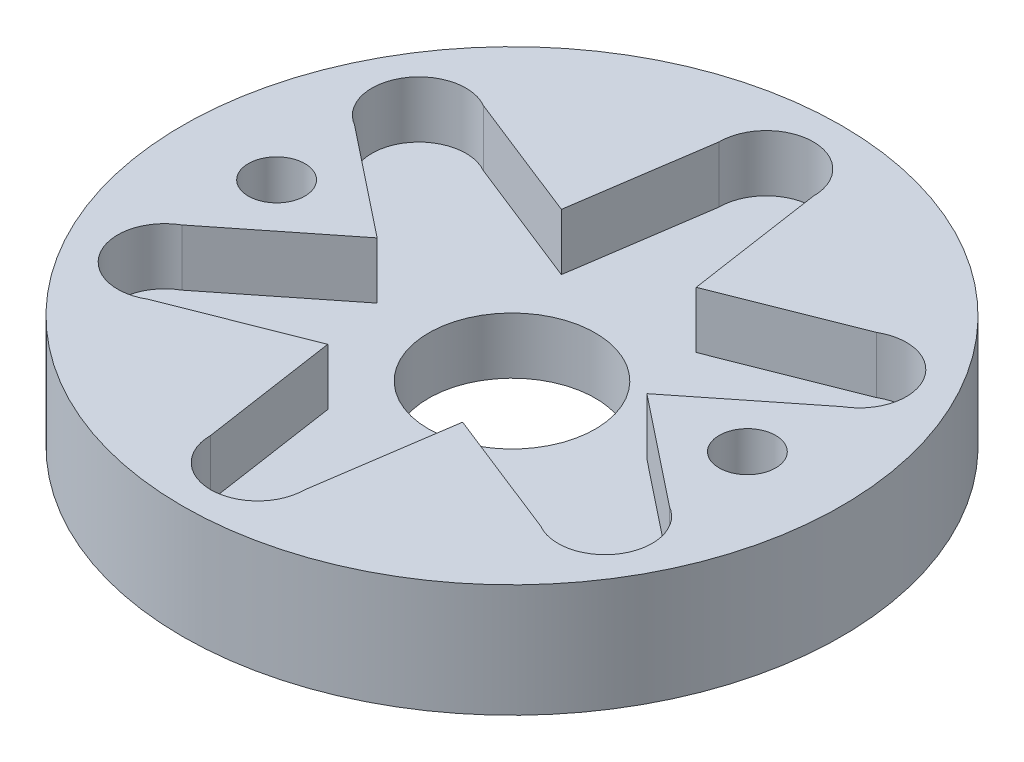
ISO-10303-21;
HEADER;
FILE_DESCRIPTION(('STEP AP214'),'2;1');
FILE_NAME('part.step','',(''),(''),'','','');
FILE_SCHEMA(('AUTOMOTIVE_DESIGN { 1 0 10303 214 1 1 1 1 }'));
ENDSEC;
DATA;
#1=APPLICATION_CONTEXT('core data for automotive mechanical design processes');
#2=APPLICATION_PROTOCOL_DEFINITION('international standard','automotive_design',2000,#1);
#3=PRODUCT_CONTEXT('',#1,'mechanical');
#4=PRODUCT('Part','Part','',(#3));
#5=PRODUCT_RELATED_PRODUCT_CATEGORY('part','',(#4));
#6=PRODUCT_DEFINITION_FORMATION('','',#4);
#7=PRODUCT_DEFINITION_CONTEXT('part definition',#1,'design');
#8=PRODUCT_DEFINITION('design','',#6,#7);
#9=PRODUCT_DEFINITION_SHAPE('','',#8);
#10=(LENGTH_UNIT() NAMED_UNIT(*) SI_UNIT(.MILLI.,.METRE.));
#11=(NAMED_UNIT(*) PLANE_ANGLE_UNIT() SI_UNIT($,.RADIAN.));
#12=(NAMED_UNIT(*) SI_UNIT($,.STERADIAN.) SOLID_ANGLE_UNIT());
#13=UNCERTAINTY_MEASURE_WITH_UNIT(LENGTH_MEASURE(1.E-05),#10,'distance_accuracy_value','');
#14=(GEOMETRIC_REPRESENTATION_CONTEXT(3) GLOBAL_UNCERTAINTY_ASSIGNED_CONTEXT((#13)) GLOBAL_UNIT_ASSIGNED_CONTEXT((#10,
#11,#12)) REPRESENTATION_CONTEXT('',''));
#15=CARTESIAN_POINT('',(0.,0.,0.));
#16=DIRECTION('',(0.,0.,1.));
#17=DIRECTION('',(1.,0.,0.));
#18=AXIS2_PLACEMENT_3D('',#15,#16,#17);
#19=CARTESIAN_POINT('',(12.5,-4.,0.));
#20=DIRECTION('',(0.,1.,0.));
#21=DIRECTION('',(0.,0.,1.));
#22=AXIS2_PLACEMENT_3D('',#19,#20,#21);
#23=CYLINDRICAL_SURFACE('',#22,1.5);
#24=CARTESIAN_POINT('',(12.5,6.,0.));
#25=DIRECTION('',(0.,1.,0.));
#26=DIRECTION('',(0.,0.,1.));
#27=AXIS2_PLACEMENT_3D('',#24,#25,#26);
#28=CIRCLE('',#27,1.5);
#29=CARTESIAN_POINT('',(12.5,6.,1.5));
#30=VERTEX_POINT('',#29);
#31=EDGE_CURVE('E367',#30,#30,#28,.T.);
#32=ORIENTED_EDGE('',*,*,#31,.T.);
#33=EDGE_LOOP('',(#32));
#34=FACE_BOUND('',#33,.T.);
#35=CARTESIAN_POINT('',(12.5,1.5,0.));
#36=DIRECTION('',(0.,-1.,0.));
#37=DIRECTION('',(0.,0.,-1.));
#38=AXIS2_PLACEMENT_3D('',#35,#36,#37);
#39=CIRCLE('',#38,1.5);
#40=CARTESIAN_POINT('',(12.5,1.5,-1.5));
#41=VERTEX_POINT('',#40);
#42=EDGE_CURVE('E97',#41,#41,#39,.F.);
#43=ORIENTED_EDGE('',*,*,#42,.F.);
#44=EDGE_LOOP('',(#43));
#45=FACE_BOUND('',#44,.T.);
#46=ADVANCED_FACE('F93',(#34,#45),#23,.F.);
#47=CARTESIAN_POINT('',(-12.5,-4.,0.));
#48=DIRECTION('',(0.,1.,0.));
#49=DIRECTION('',(0.,0.,1.));
#50=AXIS2_PLACEMENT_3D('',#47,#48,#49);
#51=CYLINDRICAL_SURFACE('',#50,1.5);
#52=CARTESIAN_POINT('',(-12.5,6.,0.));
#53=DIRECTION('',(0.,1.,0.));
#54=DIRECTION('',(0.,0.,1.));
#55=AXIS2_PLACEMENT_3D('',#52,#53,#54);
#56=CIRCLE('',#55,1.5);
#57=CARTESIAN_POINT('',(-12.5,6.,1.5));
#58=VERTEX_POINT('',#57);
#59=EDGE_CURVE('E268',#58,#58,#56,.T.);
#60=ORIENTED_EDGE('',*,*,#59,.T.);
#61=EDGE_LOOP('',(#60));
#62=FACE_BOUND('',#61,.T.);
#63=CARTESIAN_POINT('',(-12.5,1.5,0.));
#64=DIRECTION('',(0.,-1.,0.));
#65=DIRECTION('',(0.,0.,-1.));
#66=AXIS2_PLACEMENT_3D('',#63,#64,#65);
#67=CIRCLE('',#66,1.5);
#68=CARTESIAN_POINT('',(-12.5,1.5,-1.5));
#69=VERTEX_POINT('',#68);
#70=EDGE_CURVE('E361',#69,#69,#67,.F.);
#71=ORIENTED_EDGE('',*,*,#70,.F.);
#72=EDGE_LOOP('',(#71));
#73=FACE_BOUND('',#72,.T.);
#74=ADVANCED_FACE('F429',(#62,#73),#51,.F.);
#75=CARTESIAN_POINT('',(-11.6913429510899,6.,-6.74999999999999));
#76=DIRECTION('',(0.,-1.,0.));
#77=DIRECTION('',(0.,0.,-1.));
#78=AXIS2_PLACEMENT_3D('',#75,#76,#77);
#79=CYLINDRICAL_SURFACE('',#78,2.5);
#80=CARTESIAN_POINT('',(-11.6913429510899,3.,-6.74999999999999));
#81=DIRECTION('',(0.,1.,0.));
#82=DIRECTION('',(0.,0.,1.));
#83=AXIS2_PLACEMENT_3D('',#80,#81,#82);
#84=CIRCLE('',#83,2.5);
#85=CARTESIAN_POINT('',(-10.4413429510899,3.,-8.91506350946109));
#86=VERTEX_POINT('',#85);
#87=CARTESIAN_POINT('',(-12.9413429510899,3.,-4.58493649053889));
#88=VERTEX_POINT('',#87);
#89=EDGE_CURVE('E110',#86,#88,#84,.T.);
#90=ORIENTED_EDGE('',*,*,#89,.F.);
#91=DIRECTION('',(0.,-1.,0.));
#92=VECTOR('',#91,1.);
#93=CARTESIAN_POINT('',(-10.4413429510899,6.,-8.91506350946109));
#94=LINE('',#93,#92);
#95=CARTESIAN_POINT('',(-10.4413429510899,6.,-8.91506350946109));
#96=VERTEX_POINT('',#95);
#97=EDGE_CURVE('E12',#96,#86,#94,.T.);
#98=ORIENTED_EDGE('',*,*,#97,.F.);
#99=CARTESIAN_POINT('',(-11.6913429510899,6.,-6.74999999999999));
#100=DIRECTION('',(0.,1.,0.));
#101=DIRECTION('',(0.,0.,1.));
#102=AXIS2_PLACEMENT_3D('',#99,#100,#101);
#103=CIRCLE('',#102,2.5);
#104=CARTESIAN_POINT('',(-12.9413429510899,6.,-4.58493649053889));
#105=VERTEX_POINT('',#104);
#106=EDGE_CURVE('E269',#96,#105,#103,.T.);
#107=ORIENTED_EDGE('',*,*,#106,.T.);
#108=DIRECTION('',(0.,-1.,0.));
#109=VECTOR('',#108,1.);
#110=CARTESIAN_POINT('',(-12.9413429510899,6.,-4.58493649053889));
#111=LINE('',#110,#109);
#112=EDGE_CURVE('E231',#105,#88,#111,.T.);
#113=ORIENTED_EDGE('',*,*,#112,.T.);
#114=EDGE_LOOP('',(#90,#98,#107,#113));
#115=FACE_BOUND('',#114,.T.);
#116=ADVANCED_FACE('F95',(#115),#79,.F.);
#117=CARTESIAN_POINT('',(1.63672705202787,6.,-4.13959239881188));
#118=DIRECTION('',(0.367686867782864,0.,-0.929949658454707));
#119=DIRECTION('',(-0.929949658454707,0.,-0.367686867782864));
#120=AXIS2_PLACEMENT_3D('',#117,#118,#119);
#121=PLANE('',#120);
#122=ORIENTED_EDGE('',*,*,#97,.T.);
#123=DIRECTION('',(0.929949658454707,0.,0.367686867782864));
#124=VECTOR('',#123,1.);
#125=CARTESIAN_POINT('',(1.63672705202787,3.,-4.13959239881188));
#126=LINE('',#125,#124);
#127=CARTESIAN_POINT('',(-3.58109149415789,3.,-6.20263241443421));
#128=VERTEX_POINT('',#127);
#129=EDGE_CURVE('E116',#86,#128,#126,.T.);
#130=ORIENTED_EDGE('',*,*,#129,.T.);
#131=DIRECTION('',(0.,-1.,0.));
#132=VECTOR('',#131,1.);
#133=CARTESIAN_POINT('',(-3.58109149415789,6.,-6.20263241443421));
#134=LINE('',#133,#132);
#135=CARTESIAN_POINT('',(-3.58109149415789,6.,-6.20263241443421));
#136=VERTEX_POINT('',#135);
#137=EDGE_CURVE('E102',#136,#128,#134,.T.);
#138=ORIENTED_EDGE('',*,*,#137,.F.);
#139=DIRECTION('',(0.929949658454707,0.,0.367686867782864));
#140=VECTOR('',#139,1.);
#141=CARTESIAN_POINT('',(1.63672705202787,6.,-4.13959239881188));
#142=LINE('',#141,#140);
#143=EDGE_CURVE('E272',#96,#136,#142,.T.);
#144=ORIENTED_EDGE('',*,*,#143,.F.);
#145=EDGE_LOOP('',(#122,#130,#138,#144));
#146=FACE_BOUND('',#145,.T.);
#147=ADVANCED_FACE('F422',(#146),#121,.F.);
#148=CARTESIAN_POINT('',(-4.40335570469799,6.,-0.65234899328859));
#149=DIRECTION('',(0.989203462353871,0.,0.146548661089462));
#150=DIRECTION('',(0.146548661089462,0.,-0.989203462353871));
#151=AXIS2_PLACEMENT_3D('',#148,#149,#150);
#152=PLANE('',#151);
#153=DIRECTION('',(-0.146548661089462,0.,0.989203462353871));
#154=VECTOR('',#153,1.);
#155=CARTESIAN_POINT('',(-4.40335570469799,3.,-0.65234899328859));
#156=LINE('',#155,#154);
#157=CARTESIAN_POINT('',(-2.5,3.,-13.5));
#158=VERTEX_POINT('',#157);
#159=EDGE_CURVE('E405',#158,#128,#156,.T.);
#160=ORIENTED_EDGE('',*,*,#159,.F.);
#161=DIRECTION('',(0.,-1.,0.));
#162=VECTOR('',#161,1.);
#163=CARTESIAN_POINT('',(-2.5,6.,-13.5));
#164=LINE('',#163,#162);
#165=CARTESIAN_POINT('',(-2.5,6.,-13.5));
#166=VERTEX_POINT('',#165);
#167=EDGE_CURVE('E358',#166,#158,#164,.T.);
#168=ORIENTED_EDGE('',*,*,#167,.F.);
#169=DIRECTION('',(-0.146548661089462,0.,0.989203462353871));
#170=VECTOR('',#169,1.);
#171=CARTESIAN_POINT('',(-4.40335570469799,6.,-0.65234899328859));
#172=LINE('',#171,#170);
#173=EDGE_CURVE('E274',#166,#136,#172,.T.);
#174=ORIENTED_EDGE('',*,*,#173,.T.);
#175=ORIENTED_EDGE('',*,*,#137,.T.);
#176=EDGE_LOOP('',(#160,#168,#174,#175));
#177=FACE_BOUND('',#176,.T.);
#178=ADVANCED_FACE('F409',(#177),#152,.T.);
#179=CARTESIAN_POINT('',(0.,6.,-13.5));
#180=DIRECTION('',(0.,-1.,0.));
#181=DIRECTION('',(0.,0.,-1.));
#182=AXIS2_PLACEMENT_3D('',#179,#180,#181);
#183=CYLINDRICAL_SURFACE('',#182,2.5);
#184=CARTESIAN_POINT('',(0.,3.,-13.5));
#185=DIRECTION('',(0.,1.,0.));
#186=DIRECTION('',(0.,0.,1.));
#187=AXIS2_PLACEMENT_3D('',#184,#185,#186);
#188=CIRCLE('',#187,2.5);
#189=CARTESIAN_POINT('',(2.5,3.,-13.5));
#190=VERTEX_POINT('',#189);
#191=EDGE_CURVE('E402',#190,#158,#188,.T.);
#192=ORIENTED_EDGE('',*,*,#191,.F.);
#193=DIRECTION('',(0.,-1.,0.));
#194=VECTOR('',#193,1.);
#195=CARTESIAN_POINT('',(2.5,6.,-13.5));
#196=LINE('',#195,#194);
#197=CARTESIAN_POINT('',(2.5,6.,-13.5));
#198=VERTEX_POINT('',#197);
#199=EDGE_CURVE('E355',#198,#190,#196,.T.);
#200=ORIENTED_EDGE('',*,*,#199,.F.);
#201=CARTESIAN_POINT('',(0.,6.,-13.5));
#202=DIRECTION('',(0.,1.,0.));
#203=DIRECTION('',(0.,0.,1.));
#204=AXIS2_PLACEMENT_3D('',#201,#202,#203);
#205=CIRCLE('',#204,2.5);
#206=EDGE_CURVE('E277',#198,#166,#205,.T.);
#207=ORIENTED_EDGE('',*,*,#206,.T.);
#208=ORIENTED_EDGE('',*,*,#167,.T.);
#209=EDGE_LOOP('',(#192,#200,#207,#208));
#210=FACE_BOUND('',#209,.T.);
#211=ADVANCED_FACE('F412',(#210),#183,.F.);
#212=CARTESIAN_POINT('',(4.40335570469799,6.,-0.65234899328859));
#213=DIRECTION('',(0.989203462353871,0.,-0.146548661089462));
#214=DIRECTION('',(-0.146548661089462,0.,-0.989203462353871));
#215=AXIS2_PLACEMENT_3D('',#212,#213,#214);
#216=PLANE('',#215);
#217=ORIENTED_EDGE('',*,*,#199,.T.);
#218=DIRECTION('',(0.146548661089462,0.,0.989203462353871));
#219=VECTOR('',#218,1.);
#220=CARTESIAN_POINT('',(4.40335570469799,3.,-0.65234899328859));
#221=LINE('',#220,#219);
#222=CARTESIAN_POINT('',(3.58109149415789,3.,-6.20263241443422));
#223=VERTEX_POINT('',#222);
#224=EDGE_CURVE('E400',#190,#223,#221,.T.);
#225=ORIENTED_EDGE('',*,*,#224,.T.);
#226=DIRECTION('',(0.,-1.,0.));
#227=VECTOR('',#226,1.);
#228=CARTESIAN_POINT('',(3.58109149415789,6.,-6.20263241443422));
#229=LINE('',#228,#227);
#230=CARTESIAN_POINT('',(3.58109149415789,6.,-6.20263241443422));
#231=VERTEX_POINT('',#230);
#232=EDGE_CURVE('E352',#231,#223,#229,.T.);
#233=ORIENTED_EDGE('',*,*,#232,.F.);
#234=DIRECTION('',(0.146548661089462,0.,0.989203462353871));
#235=VECTOR('',#234,1.);
#236=CARTESIAN_POINT('',(4.40335570469799,6.,-0.65234899328859));
#237=LINE('',#236,#235);
#238=EDGE_CURVE('E280',#198,#231,#237,.T.);
#239=ORIENTED_EDGE('',*,*,#238,.F.);
#240=EDGE_LOOP('',(#217,#225,#233,#239));
#241=FACE_BOUND('',#240,.T.);
#242=ADVANCED_FACE('F506',(#241),#216,.F.);
#243=CARTESIAN_POINT('',(-1.63672705202787,6.,-4.13959239881188));
#244=DIRECTION('',(0.367686867782865,0.,0.929949658454707));
#245=DIRECTION('',(0.929949658454707,0.,-0.367686867782865));
#246=AXIS2_PLACEMENT_3D('',#243,#244,#245);
#247=PLANE('',#246);
#248=DIRECTION('',(-0.929949658454707,0.,0.367686867782865));
#249=VECTOR('',#248,1.);
#250=CARTESIAN_POINT('',(-1.63672705202787,3.,-4.13959239881188));
#251=LINE('',#250,#249);
#252=CARTESIAN_POINT('',(10.4413429510899,3.,-8.9150635094611));
#253=VERTEX_POINT('',#252);
#254=EDGE_CURVE('E397',#253,#223,#251,.T.);
#255=ORIENTED_EDGE('',*,*,#254,.F.);
#256=DIRECTION('',(0.,-1.,0.));
#257=VECTOR('',#256,1.);
#258=CARTESIAN_POINT('',(10.4413429510899,6.,-8.9150635094611));
#259=LINE('',#258,#257);
#260=CARTESIAN_POINT('',(10.4413429510899,6.,-8.9150635094611));
#261=VERTEX_POINT('',#260);
#262=EDGE_CURVE('E349',#261,#253,#259,.T.);
#263=ORIENTED_EDGE('',*,*,#262,.F.);
#264=DIRECTION('',(-0.929949658454707,0.,0.367686867782865));
#265=VECTOR('',#264,1.);
#266=CARTESIAN_POINT('',(-1.63672705202787,6.,-4.13959239881188));
#267=LINE('',#266,#265);
#268=EDGE_CURVE('E282',#261,#231,#267,.T.);
#269=ORIENTED_EDGE('',*,*,#268,.T.);
#270=ORIENTED_EDGE('',*,*,#232,.T.);
#271=EDGE_LOOP('',(#255,#263,#269,#270));
#272=FACE_BOUND('',#271,.T.);
#273=ADVANCED_FACE('F502',(#272),#247,.T.);
#274=CARTESIAN_POINT('',(11.6913429510899,6.,-6.75));
#275=DIRECTION('',(0.,-1.,0.));
#276=DIRECTION('',(0.,0.,-1.));
#277=AXIS2_PLACEMENT_3D('',#274,#275,#276);
#278=CYLINDRICAL_SURFACE('',#277,2.5);
#279=CARTESIAN_POINT('',(11.6913429510899,3.,-6.75));
#280=DIRECTION('',(0.,1.,0.));
#281=DIRECTION('',(0.,0.,1.));
#282=AXIS2_PLACEMENT_3D('',#279,#280,#281);
#283=CIRCLE('',#282,2.5);
#284=CARTESIAN_POINT('',(12.9413429510899,3.,-4.58493649053891));
#285=VERTEX_POINT('',#284);
#286=EDGE_CURVE('E394',#285,#253,#283,.T.);
#287=ORIENTED_EDGE('',*,*,#286,.F.);
#288=DIRECTION('',(0.,-1.,0.));
#289=VECTOR('',#288,1.);
#290=CARTESIAN_POINT('',(12.9413429510899,6.,-4.58493649053891));
#291=LINE('',#290,#289);
#292=CARTESIAN_POINT('',(12.9413429510899,6.,-4.58493649053891));
#293=VERTEX_POINT('',#292);
#294=EDGE_CURVE('E346',#293,#285,#291,.T.);
#295=ORIENTED_EDGE('',*,*,#294,.F.);
#296=CARTESIAN_POINT('',(11.6913429510899,6.,-6.75));
#297=DIRECTION('',(0.,1.,0.));
#298=DIRECTION('',(0.,0.,1.));
#299=AXIS2_PLACEMENT_3D('',#296,#297,#298);
#300=CIRCLE('',#299,2.5);
#301=EDGE_CURVE('E285',#293,#261,#300,.T.);
#302=ORIENTED_EDGE('',*,*,#301,.T.);
#303=ORIENTED_EDGE('',*,*,#262,.T.);
#304=EDGE_LOOP('',(#287,#295,#302,#303));
#305=FACE_BOUND('',#304,.T.);
#306=ADVANCED_FACE('F498',(#305),#278,.F.);
#307=CARTESIAN_POINT('',(2.76662865267012,6.,3.48724340552329));
#308=DIRECTION('',(0.621516594571006,0.,0.783400997365245));
#309=DIRECTION('',(0.783400997365244,0.,-0.621516594571006));
#310=AXIS2_PLACEMENT_3D('',#307,#308,#309);
#311=PLANE('',#310);
#312=ORIENTED_EDGE('',*,*,#294,.T.);
#313=DIRECTION('',(-0.783400997365245,0.,0.621516594571006));
#314=VECTOR('',#313,1.);
#315=CARTESIAN_POINT('',(2.76662865267012,3.,3.48724340552329));
#316=LINE('',#315,#314);
#317=CARTESIAN_POINT('',(7.16218298831579,3.,0.));
#318=VERTEX_POINT('',#317);
#319=EDGE_CURVE('E392',#285,#318,#316,.T.);
#320=ORIENTED_EDGE('',*,*,#319,.T.);
#321=DIRECTION('',(0.,-1.,0.));
#322=VECTOR('',#321,1.);
#323=CARTESIAN_POINT('',(7.16218298831579,6.,0.));
#324=LINE('',#323,#322);
#325=CARTESIAN_POINT('',(7.16218298831579,6.,0.));
#326=VERTEX_POINT('',#325);
#327=EDGE_CURVE('E343',#326,#318,#324,.T.);
#328=ORIENTED_EDGE('',*,*,#327,.F.);
#329=DIRECTION('',(-0.783400997365245,0.,0.621516594571006));
#330=VECTOR('',#329,1.);
#331=CARTESIAN_POINT('',(2.76662865267012,6.,3.48724340552329));
#332=LINE('',#331,#330);
#333=EDGE_CURVE('E288',#293,#326,#332,.T.);
#334=ORIENTED_EDGE('',*,*,#333,.F.);
#335=EDGE_LOOP('',(#312,#320,#328,#334));
#336=FACE_BOUND('',#335,.T.);
#337=ADVANCED_FACE('F494',(#336),#311,.F.);
#338=CARTESIAN_POINT('',(2.76662865267012,6.,-3.48724340552329));
#339=DIRECTION('',(-0.621516594571006,0.,0.783400997365244));
#340=DIRECTION('',(0.783400997365245,0.,0.621516594571006));
#341=AXIS2_PLACEMENT_3D('',#338,#339,#340);
#342=PLANE('',#341);
#343=DIRECTION('',(-0.783400997365245,0.,-0.621516594571006));
#344=VECTOR('',#343,1.);
#345=CARTESIAN_POINT('',(2.76662865267012,3.,-3.48724340552329));
#346=LINE('',#345,#344);
#347=CARTESIAN_POINT('',(12.9413429510899,3.,4.5849364905389));
#348=VERTEX_POINT('',#347);
#349=EDGE_CURVE('E389',#348,#318,#346,.T.);
#350=ORIENTED_EDGE('',*,*,#349,.F.);
#351=DIRECTION('',(0.,-1.,0.));
#352=VECTOR('',#351,1.);
#353=CARTESIAN_POINT('',(12.9413429510899,6.,4.5849364905389));
#354=LINE('',#353,#352);
#355=CARTESIAN_POINT('',(12.9413429510899,6.,4.5849364905389));
#356=VERTEX_POINT('',#355);
#357=EDGE_CURVE('E340',#356,#348,#354,.T.);
#358=ORIENTED_EDGE('',*,*,#357,.F.);
#359=DIRECTION('',(-0.783400997365245,0.,-0.621516594571006));
#360=VECTOR('',#359,1.);
#361=CARTESIAN_POINT('',(2.76662865267012,6.,-3.48724340552329));
#362=LINE('',#361,#360);
#363=EDGE_CURVE('E290',#356,#326,#362,.T.);
#364=ORIENTED_EDGE('',*,*,#363,.T.);
#365=ORIENTED_EDGE('',*,*,#327,.T.);
#366=EDGE_LOOP('',(#350,#358,#364,#365));
#367=FACE_BOUND('',#366,.T.);
#368=ADVANCED_FACE('F490',(#367),#342,.T.);
#369=CARTESIAN_POINT('',(11.6913429510899,6.,6.75));
#370=DIRECTION('',(0.,-1.,0.));
#371=DIRECTION('',(0.,0.,-1.));
#372=AXIS2_PLACEMENT_3D('',#369,#370,#371);
#373=CYLINDRICAL_SURFACE('',#372,2.5);
#374=CARTESIAN_POINT('',(11.6913429510899,3.,6.75));
#375=DIRECTION('',(0.,1.,0.));
#376=DIRECTION('',(0.,0.,1.));
#377=AXIS2_PLACEMENT_3D('',#374,#375,#376);
#378=CIRCLE('',#377,2.5);
#379=CARTESIAN_POINT('',(10.4413429510899,3.,8.9150635094611));
#380=VERTEX_POINT('',#379);
#381=EDGE_CURVE('E387',#380,#348,#378,.T.);
#382=ORIENTED_EDGE('',*,*,#381,.F.);
#383=DIRECTION('',(0.,-1.,0.));
#384=VECTOR('',#383,1.);
#385=CARTESIAN_POINT('',(10.4413429510899,6.,8.9150635094611));
#386=LINE('',#385,#384);
#387=CARTESIAN_POINT('',(10.4413429510899,6.,8.9150635094611));
#388=VERTEX_POINT('',#387);
#389=EDGE_CURVE('E337',#388,#380,#386,.T.);
#390=ORIENTED_EDGE('',*,*,#389,.F.);
#391=CARTESIAN_POINT('',(11.6913429510899,6.,6.75));
#392=DIRECTION('',(0.,1.,0.));
#393=DIRECTION('',(0.,0.,1.));
#394=AXIS2_PLACEMENT_3D('',#391,#392,#393);
#395=CIRCLE('',#394,2.5);
#396=EDGE_CURVE('E293',#388,#356,#395,.T.);
#397=ORIENTED_EDGE('',*,*,#396,.T.);
#398=ORIENTED_EDGE('',*,*,#357,.T.);
#399=EDGE_LOOP('',(#382,#390,#397,#398));
#400=FACE_BOUND('',#399,.T.);
#401=ADVANCED_FACE('F486',(#400),#373,.F.);
#402=CARTESIAN_POINT('',(-1.63672705202787,6.,4.13959239881188));
#403=DIRECTION('',(-0.367686867782865,0.,0.929949658454707));
#404=DIRECTION('',(0.929949658454707,0.,0.367686867782865));
#405=AXIS2_PLACEMENT_3D('',#402,#403,#404);
#406=PLANE('',#405);
#407=ORIENTED_EDGE('',*,*,#389,.T.);
#408=DIRECTION('',(-0.929949658454707,0.,-0.367686867782865));
#409=VECTOR('',#408,1.);
#410=CARTESIAN_POINT('',(-1.63672705202787,3.,4.13959239881188));
#411=LINE('',#410,#409);
#412=CARTESIAN_POINT('',(3.58109149415789,3.,6.20263241443421));
#413=VERTEX_POINT('',#412);
#414=EDGE_CURVE('E267',#380,#413,#411,.T.);
#415=ORIENTED_EDGE('',*,*,#414,.T.);
#416=DIRECTION('',(0.,-1.,0.));
#417=VECTOR('',#416,1.);
#418=CARTESIAN_POINT('',(3.58109149415789,6.,6.20263241443421));
#419=LINE('',#418,#417);
#420=CARTESIAN_POINT('',(3.58109149415789,6.,6.20263241443421));
#421=VERTEX_POINT('',#420);
#422=EDGE_CURVE('E334',#421,#413,#419,.T.);
#423=ORIENTED_EDGE('',*,*,#422,.F.);
#424=DIRECTION('',(-0.929949658454707,0.,-0.367686867782865));
#425=VECTOR('',#424,1.);
#426=CARTESIAN_POINT('',(-1.63672705202787,6.,4.13959239881188));
#427=LINE('',#426,#425);
#428=EDGE_CURVE('E296',#388,#421,#427,.T.);
#429=ORIENTED_EDGE('',*,*,#428,.F.);
#430=EDGE_LOOP('',(#407,#415,#423,#429));
#431=FACE_BOUND('',#430,.T.);
#432=ADVANCED_FACE('F482',(#431),#406,.F.);
#433=CARTESIAN_POINT('',(4.40335570469799,6.,0.65234899328859));
#434=DIRECTION('',(-0.989203462353871,0.,-0.146548661089462));
#435=DIRECTION('',(-0.146548661089462,0.,0.989203462353871));
#436=AXIS2_PLACEMENT_3D('',#433,#434,#435);
#437=PLANE('',#436);
#438=DIRECTION('',(0.146548661089462,0.,-0.989203462353871));
#439=VECTOR('',#438,1.);
#440=CARTESIAN_POINT('',(4.40335570469799,3.,0.65234899328859));
#441=LINE('',#440,#439);
#442=CARTESIAN_POINT('',(2.5,3.,13.5));
#443=VERTEX_POINT('',#442);
#444=EDGE_CURVE('E257',#443,#413,#441,.T.);
#445=ORIENTED_EDGE('',*,*,#444,.F.);
#446=DIRECTION('',(0.,-1.,0.));
#447=VECTOR('',#446,1.);
#448=CARTESIAN_POINT('',(2.5,6.,13.5));
#449=LINE('',#448,#447);
#450=CARTESIAN_POINT('',(2.5,6.,13.5));
#451=VERTEX_POINT('',#450);
#452=EDGE_CURVE('E331',#451,#443,#449,.T.);
#453=ORIENTED_EDGE('',*,*,#452,.F.);
#454=DIRECTION('',(0.146548661089462,0.,-0.989203462353871));
#455=VECTOR('',#454,1.);
#456=CARTESIAN_POINT('',(4.40335570469799,6.,0.65234899328859));
#457=LINE('',#456,#455);
#458=EDGE_CURVE('E298',#451,#421,#457,.T.);
#459=ORIENTED_EDGE('',*,*,#458,.T.);
#460=ORIENTED_EDGE('',*,*,#422,.T.);
#461=EDGE_LOOP('',(#445,#453,#459,#460));
#462=FACE_BOUND('',#461,.T.);
#463=ADVANCED_FACE('F478',(#462),#437,.T.);
#464=CARTESIAN_POINT('',(0.,6.,13.5));
#465=DIRECTION('',(0.,-1.,0.));
#466=DIRECTION('',(0.,0.,-1.));
#467=AXIS2_PLACEMENT_3D('',#464,#465,#466);
#468=CYLINDRICAL_SURFACE('',#467,2.5);
#469=CARTESIAN_POINT('',(0.,3.,13.5));
#470=DIRECTION('',(0.,1.,0.));
#471=DIRECTION('',(0.,0.,1.));
#472=AXIS2_PLACEMENT_3D('',#469,#470,#471);
#473=CIRCLE('',#472,2.5);
#474=CARTESIAN_POINT('',(-2.5,3.,13.5));
#475=VERTEX_POINT('',#474);
#476=EDGE_CURVE('E254',#475,#443,#473,.T.);
#477=ORIENTED_EDGE('',*,*,#476,.F.);
#478=DIRECTION('',(0.,-1.,0.));
#479=VECTOR('',#478,1.);
#480=CARTESIAN_POINT('',(-2.5,6.,13.5));
#481=LINE('',#480,#479);
#482=CARTESIAN_POINT('',(-2.5,6.,13.5));
#483=VERTEX_POINT('',#482);
#484=EDGE_CURVE('E328',#483,#475,#481,.T.);
#485=ORIENTED_EDGE('',*,*,#484,.F.);
#486=CARTESIAN_POINT('',(0.,6.,13.5));
#487=DIRECTION('',(0.,1.,0.));
#488=DIRECTION('',(0.,0.,1.));
#489=AXIS2_PLACEMENT_3D('',#486,#487,#488);
#490=CIRCLE('',#489,2.5);
#491=EDGE_CURVE('E301',#483,#451,#490,.T.);
#492=ORIENTED_EDGE('',*,*,#491,.T.);
#493=ORIENTED_EDGE('',*,*,#452,.T.);
#494=EDGE_LOOP('',(#477,#485,#492,#493));
#495=FACE_BOUND('',#494,.T.);
#496=ADVANCED_FACE('F474',(#495),#468,.F.);
#497=CARTESIAN_POINT('',(-4.40335570469799,6.,0.652348993288591));
#498=DIRECTION('',(-0.989203462353871,0.,0.146548661089462));
#499=DIRECTION('',(0.146548661089462,0.,0.989203462353871));
#500=AXIS2_PLACEMENT_3D('',#497,#498,#499);
#501=PLANE('',#500);
#502=ORIENTED_EDGE('',*,*,#484,.T.);
#503=DIRECTION('',(-0.146548661089462,0.,-0.989203462353871));
#504=VECTOR('',#503,1.);
#505=CARTESIAN_POINT('',(-4.40335570469799,3.,0.652348993288591));
#506=LINE('',#505,#504);
#507=CARTESIAN_POINT('',(-3.58109149415789,3.,6.20263241443422));
#508=VERTEX_POINT('',#507);
#509=EDGE_CURVE('E252',#475,#508,#506,.T.);
#510=ORIENTED_EDGE('',*,*,#509,.T.);
#511=DIRECTION('',(0.,-1.,0.));
#512=VECTOR('',#511,1.);
#513=CARTESIAN_POINT('',(-3.58109149415789,6.,6.20263241443422));
#514=LINE('',#513,#512);
#515=CARTESIAN_POINT('',(-3.58109149415789,6.,6.20263241443422));
#516=VERTEX_POINT('',#515);
#517=EDGE_CURVE('E325',#516,#508,#514,.T.);
#518=ORIENTED_EDGE('',*,*,#517,.F.);
#519=DIRECTION('',(-0.146548661089462,0.,-0.989203462353871));
#520=VECTOR('',#519,1.);
#521=CARTESIAN_POINT('',(-4.40335570469799,6.,0.652348993288591));
#522=LINE('',#521,#520);
#523=EDGE_CURVE('E304',#483,#516,#522,.T.);
#524=ORIENTED_EDGE('',*,*,#523,.F.);
#525=EDGE_LOOP('',(#502,#510,#518,#524));
#526=FACE_BOUND('',#525,.T.);
#527=ADVANCED_FACE('F470',(#526),#501,.F.);
#528=CARTESIAN_POINT('',(1.63672705202787,6.,4.13959239881188));
#529=DIRECTION('',(-0.367686867782865,0.,-0.929949658454707));
#530=DIRECTION('',(-0.929949658454707,0.,0.367686867782865));
#531=AXIS2_PLACEMENT_3D('',#528,#529,#530);
#532=PLANE('',#531);
#533=DIRECTION('',(0.929949658454707,0.,-0.367686867782865));
#534=VECTOR('',#533,1.);
#535=CARTESIAN_POINT('',(1.63672705202787,3.,4.13959239881188));
#536=LINE('',#535,#534);
#537=CARTESIAN_POINT('',(-10.4413429510899,3.,8.9150635094611));
#538=VERTEX_POINT('',#537);
#539=EDGE_CURVE('E249',#538,#508,#536,.T.);
#540=ORIENTED_EDGE('',*,*,#539,.F.);
#541=DIRECTION('',(0.,-1.,0.));
#542=VECTOR('',#541,1.);
#543=CARTESIAN_POINT('',(-10.4413429510899,6.,8.9150635094611));
#544=LINE('',#543,#542);
#545=CARTESIAN_POINT('',(-10.4413429510899,6.,8.9150635094611));
#546=VERTEX_POINT('',#545);
#547=EDGE_CURVE('E322',#546,#538,#544,.T.);
#548=ORIENTED_EDGE('',*,*,#547,.F.);
#549=DIRECTION('',(0.929949658454707,0.,-0.367686867782865));
#550=VECTOR('',#549,1.);
#551=CARTESIAN_POINT('',(1.63672705202787,6.,4.13959239881188));
#552=LINE('',#551,#550);
#553=EDGE_CURVE('E306',#546,#516,#552,.T.);
#554=ORIENTED_EDGE('',*,*,#553,.T.);
#555=ORIENTED_EDGE('',*,*,#517,.T.);
#556=EDGE_LOOP('',(#540,#548,#554,#555));
#557=FACE_BOUND('',#556,.T.);
#558=ADVANCED_FACE('F466',(#557),#532,.T.);
#559=CARTESIAN_POINT('',(-11.6913429510899,6.,6.75000000000001));
#560=DIRECTION('',(0.,-1.,0.));
#561=DIRECTION('',(0.,0.,-1.));
#562=AXIS2_PLACEMENT_3D('',#559,#560,#561);
#563=CYLINDRICAL_SURFACE('',#562,2.5);
#564=CARTESIAN_POINT('',(-11.6913429510899,3.,6.75000000000001));
#565=DIRECTION('',(0.,1.,0.));
#566=DIRECTION('',(0.,0.,1.));
#567=AXIS2_PLACEMENT_3D('',#564,#565,#566);
#568=CIRCLE('',#567,2.5);
#569=CARTESIAN_POINT('',(-12.9413429510899,3.,4.58493649053891));
#570=VERTEX_POINT('',#569);
#571=EDGE_CURVE('E239',#570,#538,#568,.T.);
#572=ORIENTED_EDGE('',*,*,#571,.F.);
#573=DIRECTION('',(0.,-1.,0.));
#574=VECTOR('',#573,1.);
#575=CARTESIAN_POINT('',(-12.9413429510899,6.,4.58493649053891));
#576=LINE('',#575,#574);
#577=CARTESIAN_POINT('',(-12.9413429510899,6.,4.58493649053891));
#578=VERTEX_POINT('',#577);
#579=EDGE_CURVE('E230',#578,#570,#576,.T.);
#580=ORIENTED_EDGE('',*,*,#579,.F.);
#581=CARTESIAN_POINT('',(-11.6913429510899,6.,6.75000000000001));
#582=DIRECTION('',(0.,1.,0.));
#583=DIRECTION('',(0.,0.,1.));
#584=AXIS2_PLACEMENT_3D('',#581,#582,#583);
#585=CIRCLE('',#584,2.5);
#586=EDGE_CURVE('E309',#578,#546,#585,.T.);
#587=ORIENTED_EDGE('',*,*,#586,.T.);
#588=ORIENTED_EDGE('',*,*,#547,.T.);
#589=EDGE_LOOP('',(#572,#580,#587,#588));
#590=FACE_BOUND('',#589,.T.);
#591=ADVANCED_FACE('F463',(#590),#563,.F.);
#592=CARTESIAN_POINT('',(-2.76662865267012,6.,-3.48724340552329));
#593=DIRECTION('',(-0.621516594571006,0.,-0.783400997365244));
#594=DIRECTION('',(-0.783400997365245,0.,0.621516594571006));
#595=AXIS2_PLACEMENT_3D('',#592,#593,#594);
#596=PLANE('',#595);
#597=ORIENTED_EDGE('',*,*,#579,.T.);
#598=DIRECTION('',(0.783400997365244,0.,-0.621516594571006));
#599=VECTOR('',#598,1.);
#600=CARTESIAN_POINT('',(-2.76662865267012,3.,-3.48724340552329));
#601=LINE('',#600,#599);
#602=CARTESIAN_POINT('',(-7.16218298831579,3.,0.));
#603=VERTEX_POINT('',#602);
#604=EDGE_CURVE('E235',#570,#603,#601,.T.);
#605=ORIENTED_EDGE('',*,*,#604,.T.);
#606=DIRECTION('',(0.,-1.,0.));
#607=VECTOR('',#606,1.);
#608=CARTESIAN_POINT('',(-7.16218298831579,6.,0.));
#609=LINE('',#608,#607);
#610=CARTESIAN_POINT('',(-7.16218298831579,6.,0.));
#611=VERTEX_POINT('',#610);
#612=EDGE_CURVE('E221',#611,#603,#609,.T.);
#613=ORIENTED_EDGE('',*,*,#612,.F.);
#614=DIRECTION('',(0.783400997365244,0.,-0.621516594571006));
#615=VECTOR('',#614,1.);
#616=CARTESIAN_POINT('',(-2.76662865267012,6.,-3.48724340552329));
#617=LINE('',#616,#615);
#618=EDGE_CURVE('E312',#578,#611,#617,.T.);
#619=ORIENTED_EDGE('',*,*,#618,.F.);
#620=EDGE_LOOP('',(#597,#605,#613,#619));
#621=FACE_BOUND('',#620,.T.);
#622=ADVANCED_FACE('F236',(#621),#596,.F.);
#623=CARTESIAN_POINT('',(-2.76662865267012,6.,3.48724340552329));
#624=DIRECTION('',(0.621516594571005,0.,-0.783400997365245));
#625=DIRECTION('',(-0.783400997365245,0.,-0.621516594571005));
#626=AXIS2_PLACEMENT_3D('',#623,#624,#625);
#627=PLANE('',#626);
#628=DIRECTION('',(0.783400997365245,0.,0.621516594571005));
#629=VECTOR('',#628,1.);
#630=CARTESIAN_POINT('',(-2.76662865267012,3.,3.48724340552329));
#631=LINE('',#630,#629);
#632=EDGE_CURVE('E225',#88,#603,#631,.T.);
#633=ORIENTED_EDGE('',*,*,#632,.F.);
#634=ORIENTED_EDGE('',*,*,#112,.F.);
#635=DIRECTION('',(0.783400997365245,0.,0.621516594571005));
#636=VECTOR('',#635,1.);
#637=CARTESIAN_POINT('',(-2.76662865267012,6.,3.48724340552329));
#638=LINE('',#637,#636);
#639=EDGE_CURVE('E227',#105,#611,#638,.T.);
#640=ORIENTED_EDGE('',*,*,#639,.T.);
#641=ORIENTED_EDGE('',*,*,#612,.T.);
#642=EDGE_LOOP('',(#633,#634,#640,#641));
#643=FACE_BOUND('',#642,.T.);
#644=ADVANCED_FACE('F223',(#643),#627,.T.);
#645=CARTESIAN_POINT('',(0.,6.,0.));
#646=DIRECTION('',(0.,-1.,0.));
#647=DIRECTION('',(0.,0.,-1.));
#648=AXIS2_PLACEMENT_3D('',#645,#646,#647);
#649=CYLINDRICAL_SURFACE('',#648,17.5);
#650=CARTESIAN_POINT('',(0.,6.,0.));
#651=DIRECTION('',(0.,1.,0.));
#652=DIRECTION('',(0.,0.,1.));
#653=AXIS2_PLACEMENT_3D('',#650,#651,#652);
#654=CIRCLE('',#653,17.5);
#655=CARTESIAN_POINT('',(0.,6.,17.5));
#656=VERTEX_POINT('',#655);
#657=EDGE_CURVE('E315',#656,#656,#654,.T.);
#658=ORIENTED_EDGE('',*,*,#657,.F.);
#659=EDGE_LOOP('',(#658));
#660=FACE_BOUND('',#659,.T.);
#661=CARTESIAN_POINT('',(0.,0.,0.));
#662=DIRECTION('',(0.,1.,0.));
#663=DIRECTION('',(0.,0.,1.));
#664=AXIS2_PLACEMENT_3D('',#661,#662,#663);
#665=CIRCLE('',#664,17.5);
#666=CARTESIAN_POINT('',(0.,0.,17.5));
#667=VERTEX_POINT('',#666);
#668=EDGE_CURVE('E263',#667,#667,#665,.T.);
#669=ORIENTED_EDGE('',*,*,#668,.T.);
#670=EDGE_LOOP('',(#669));
#671=FACE_BOUND('',#670,.T.);
#672=ADVANCED_FACE('F451',(#660,#671),#649,.T.);
#673=CARTESIAN_POINT('',(0.,6.,0.));
#674=DIRECTION('',(0.,1.,0.));
#675=DIRECTION('',(0.,0.,1.));
#676=AXIS2_PLACEMENT_3D('',#673,#674,#675);
#677=PLANE('',#676);
#678=ORIENTED_EDGE('',*,*,#59,.F.);
#679=EDGE_LOOP('',(#678));
#680=FACE_BOUND('',#679,.T.);
#681=ORIENTED_EDGE('',*,*,#31,.F.);
#682=EDGE_LOOP('',(#681));
#683=FACE_BOUND('',#682,.T.);
#684=ORIENTED_EDGE('',*,*,#106,.F.);
#685=ORIENTED_EDGE('',*,*,#143,.T.);
#686=ORIENTED_EDGE('',*,*,#173,.F.);
#687=ORIENTED_EDGE('',*,*,#206,.F.);
#688=ORIENTED_EDGE('',*,*,#238,.T.);
#689=ORIENTED_EDGE('',*,*,#268,.F.);
#690=ORIENTED_EDGE('',*,*,#301,.F.);
#691=ORIENTED_EDGE('',*,*,#333,.T.);
#692=ORIENTED_EDGE('',*,*,#363,.F.);
#693=ORIENTED_EDGE('',*,*,#396,.F.);
#694=ORIENTED_EDGE('',*,*,#428,.T.);
#695=ORIENTED_EDGE('',*,*,#458,.F.);
#696=ORIENTED_EDGE('',*,*,#491,.F.);
#697=ORIENTED_EDGE('',*,*,#523,.T.);
#698=ORIENTED_EDGE('',*,*,#553,.F.);
#699=ORIENTED_EDGE('',*,*,#586,.F.);
#700=ORIENTED_EDGE('',*,*,#618,.T.);
#701=ORIENTED_EDGE('',*,*,#639,.F.);
#702=EDGE_LOOP('',(#684,#685,#686,#687,#688,#689,#690,#691,#692,#693,#694,#695,#696,#697,#698,
#699,#700,#701));
#703=FACE_BOUND('',#702,.T.);
#704=ORIENTED_EDGE('',*,*,#657,.T.);
#705=EDGE_LOOP('',(#704));
#706=FACE_BOUND('',#705,.T.);
#707=ADVANCED_FACE('F417',(#680,#683,#703,#706),#677,.T.);
#708=CARTESIAN_POINT('',(0.,0.,0.));
#709=DIRECTION('',(0.,1.,0.));
#710=DIRECTION('',(0.,0.,1.));
#711=AXIS2_PLACEMENT_3D('',#708,#709,#710);
#712=PLANE('',#711);
#713=CARTESIAN_POINT('',(-12.5,0.,0.));
#714=DIRECTION('',(0.,-1.,0.));
#715=DIRECTION('',(0.,0.,-1.));
#716=AXIS2_PLACEMENT_3D('',#713,#714,#715);
#717=CIRCLE('',#716,3.);
#718=CARTESIAN_POINT('',(-12.5,0.,-3.));
#719=VERTEX_POINT('',#718);
#720=EDGE_CURVE('E369',#719,#719,#717,.T.);
#721=ORIENTED_EDGE('',*,*,#720,.F.);
#722=EDGE_LOOP('',(#721));
#723=FACE_BOUND('',#722,.T.);
#724=CARTESIAN_POINT('',(12.5,0.,0.));
#725=DIRECTION('',(0.,-1.,0.));
#726=DIRECTION('',(0.,0.,-1.));
#727=AXIS2_PLACEMENT_3D('',#724,#725,#726);
#728=CIRCLE('',#727,3.);
#729=CARTESIAN_POINT('',(12.5,0.,-3.));
#730=VERTEX_POINT('',#729);
#731=EDGE_CURVE('E379',#730,#730,#728,.T.);
#732=ORIENTED_EDGE('',*,*,#731,.F.);
#733=EDGE_LOOP('',(#732));
#734=FACE_BOUND('',#733,.T.);
#735=ORIENTED_EDGE('',*,*,#668,.F.);
#736=EDGE_LOOP('',(#735));
#737=FACE_BOUND('',#736,.T.);
#738=CARTESIAN_POINT('',(0.,0.,0.));
#739=DIRECTION('',(0.,1.,0.));
#740=DIRECTION('',(0.,0.,1.));
#741=AXIS2_PLACEMENT_3D('',#738,#739,#740);
#742=CIRCLE('',#741,4.425);
#743=CARTESIAN_POINT('',(0.,0.,4.425));
#744=VERTEX_POINT('',#743);
#745=EDGE_CURVE('E264',#744,#744,#742,.T.);
#746=ORIENTED_EDGE('',*,*,#745,.T.);
#747=EDGE_LOOP('',(#746));
#748=FACE_BOUND('',#747,.T.);
#749=ADVANCED_FACE('F445',(#723,#734,#737,#748),#712,.F.);
#750=CARTESIAN_POINT('',(0.,3.,0.));
#751=DIRECTION('',(0.,1.,0.));
#752=DIRECTION('',(0.,0.,1.));
#753=AXIS2_PLACEMENT_3D('',#750,#751,#752);
#754=PLANE('',#753);
#755=ORIENTED_EDGE('',*,*,#381,.T.);
#756=ORIENTED_EDGE('',*,*,#349,.T.);
#757=ORIENTED_EDGE('',*,*,#319,.F.);
#758=ORIENTED_EDGE('',*,*,#286,.T.);
#759=ORIENTED_EDGE('',*,*,#254,.T.);
#760=ORIENTED_EDGE('',*,*,#224,.F.);
#761=ORIENTED_EDGE('',*,*,#191,.T.);
#762=ORIENTED_EDGE('',*,*,#159,.T.);
#763=ORIENTED_EDGE('',*,*,#129,.F.);
#764=ORIENTED_EDGE('',*,*,#89,.T.);
#765=ORIENTED_EDGE('',*,*,#632,.T.);
#766=ORIENTED_EDGE('',*,*,#604,.F.);
#767=ORIENTED_EDGE('',*,*,#571,.T.);
#768=ORIENTED_EDGE('',*,*,#539,.T.);
#769=ORIENTED_EDGE('',*,*,#509,.F.);
#770=ORIENTED_EDGE('',*,*,#476,.T.);
#771=ORIENTED_EDGE('',*,*,#444,.T.);
#772=ORIENTED_EDGE('',*,*,#414,.F.);
#773=EDGE_LOOP('',(#755,#756,#757,#758,#759,#760,#761,#762,#763,#764,#765,#766,#767,#768,#769,
#770,#771,#772));
#774=FACE_BOUND('',#773,.T.);
#775=CARTESIAN_POINT('',(0.,3.,0.));
#776=DIRECTION('',(0.,1.,0.));
#777=DIRECTION('',(0.,0.,1.));
#778=AXIS2_PLACEMENT_3D('',#775,#776,#777);
#779=CIRCLE('',#778,4.425);
#780=CARTESIAN_POINT('',(0.,3.,4.425));
#781=VERTEX_POINT('',#780);
#782=EDGE_CURVE('E260',#781,#781,#779,.T.);
#783=ORIENTED_EDGE('',*,*,#782,.F.);
#784=EDGE_LOOP('',(#783));
#785=FACE_BOUND('',#784,.T.);
#786=ADVANCED_FACE('F242',(#774,#785),#754,.T.);
#787=CARTESIAN_POINT('',(0.,3.,0.));
#788=DIRECTION('',(0.,-1.,0.));
#789=DIRECTION('',(0.,0.,-1.));
#790=AXIS2_PLACEMENT_3D('',#787,#788,#789);
#791=CYLINDRICAL_SURFACE('',#790,4.425);
#792=ORIENTED_EDGE('',*,*,#782,.T.);
#793=EDGE_LOOP('',(#792));
#794=FACE_BOUND('',#793,.T.);
#795=ORIENTED_EDGE('',*,*,#745,.F.);
#796=EDGE_LOOP('',(#795));
#797=FACE_BOUND('',#796,.T.);
#798=ADVANCED_FACE('F444',(#794,#797),#791,.F.);
#799=CARTESIAN_POINT('',(-12.5,1.5,0.));
#800=DIRECTION('',(0.,-1.,0.));
#801=DIRECTION('',(0.,0.,-1.));
#802=AXIS2_PLACEMENT_3D('',#799,#800,#801);
#803=PLANE('',#802);
#804=CARTESIAN_POINT('',(-12.5,1.5,0.));
#805=DIRECTION('',(0.,-1.,0.));
#806=DIRECTION('',(0.,0.,-1.));
#807=AXIS2_PLACEMENT_3D('',#804,#805,#806);
#808=CIRCLE('',#807,3.);
#809=CARTESIAN_POINT('',(-12.5,1.5,-3.));
#810=VERTEX_POINT('',#809);
#811=EDGE_CURVE('E363',#810,#810,#808,.T.);
#812=ORIENTED_EDGE('',*,*,#811,.T.);
#813=EDGE_LOOP('',(#812));
#814=FACE_BOUND('',#813,.T.);
#815=ORIENTED_EDGE('',*,*,#70,.T.);
#816=EDGE_LOOP('',(#815));
#817=FACE_BOUND('',#816,.T.);
#818=ADVANCED_FACE('F446',(#814,#817),#803,.T.);
#819=CARTESIAN_POINT('',(-12.5,1.5,0.));
#820=DIRECTION('',(0.,-1.,0.));
#821=DIRECTION('',(0.,0.,-1.));
#822=AXIS2_PLACEMENT_3D('',#819,#820,#821);
#823=CYLINDRICAL_SURFACE('',#822,3.);
#824=ORIENTED_EDGE('',*,*,#811,.F.);
#825=EDGE_LOOP('',(#824));
#826=FACE_BOUND('',#825,.T.);
#827=ORIENTED_EDGE('',*,*,#720,.T.);
#828=EDGE_LOOP('',(#827));
#829=FACE_BOUND('',#828,.T.);
#830=ADVANCED_FACE('F622',(#826,#829),#823,.F.);
#831=CARTESIAN_POINT('',(12.5,1.5,0.));
#832=DIRECTION('',(0.,-1.,0.));
#833=DIRECTION('',(0.,0.,-1.));
#834=AXIS2_PLACEMENT_3D('',#831,#832,#833);
#835=PLANE('',#834);
#836=CARTESIAN_POINT('',(12.5,1.5,0.));
#837=DIRECTION('',(0.,-1.,0.));
#838=DIRECTION('',(0.,0.,-1.));
#839=AXIS2_PLACEMENT_3D('',#836,#837,#838);
#840=CIRCLE('',#839,3.);
#841=CARTESIAN_POINT('',(12.5,1.5,-3.));
#842=VERTEX_POINT('',#841);
#843=EDGE_CURVE('E374',#842,#842,#840,.T.);
#844=ORIENTED_EDGE('',*,*,#843,.T.);
#845=EDGE_LOOP('',(#844));
#846=FACE_BOUND('',#845,.T.);
#847=ORIENTED_EDGE('',*,*,#42,.T.);
#848=EDGE_LOOP('',(#847));
#849=FACE_BOUND('',#848,.T.);
#850=ADVANCED_FACE('F630',(#846,#849),#835,.T.);
#851=CARTESIAN_POINT('',(12.5,1.5,0.));
#852=DIRECTION('',(0.,-1.,0.));
#853=DIRECTION('',(0.,0.,-1.));
#854=AXIS2_PLACEMENT_3D('',#851,#852,#853);
#855=CYLINDRICAL_SURFACE('',#854,3.);
#856=ORIENTED_EDGE('',*,*,#843,.F.);
#857=EDGE_LOOP('',(#856));
#858=FACE_BOUND('',#857,.T.);
#859=ORIENTED_EDGE('',*,*,#731,.T.);
#860=EDGE_LOOP('',(#859));
#861=FACE_BOUND('',#860,.T.);
#862=ADVANCED_FACE('F639',(#858,#861),#855,.F.);
#863=CLOSED_SHELL('',(#46,#74,#116,#147,#178,#211,#242,#273,#306,#337,#368,#401,#432,#463,#496,
#527,#558,#591,#622,#644,#672,#707,#749,#786,#798,#818,#830,#850,#862));
#864=MANIFOLD_SOLID_BREP('B2',#863);
#865=ADVANCED_BREP_SHAPE_REPRESENTATION('',(#18,#864),#14);
#866=SHAPE_DEFINITION_REPRESENTATION(#9,#865);
ENDSEC;
END-ISO-10303-21;
